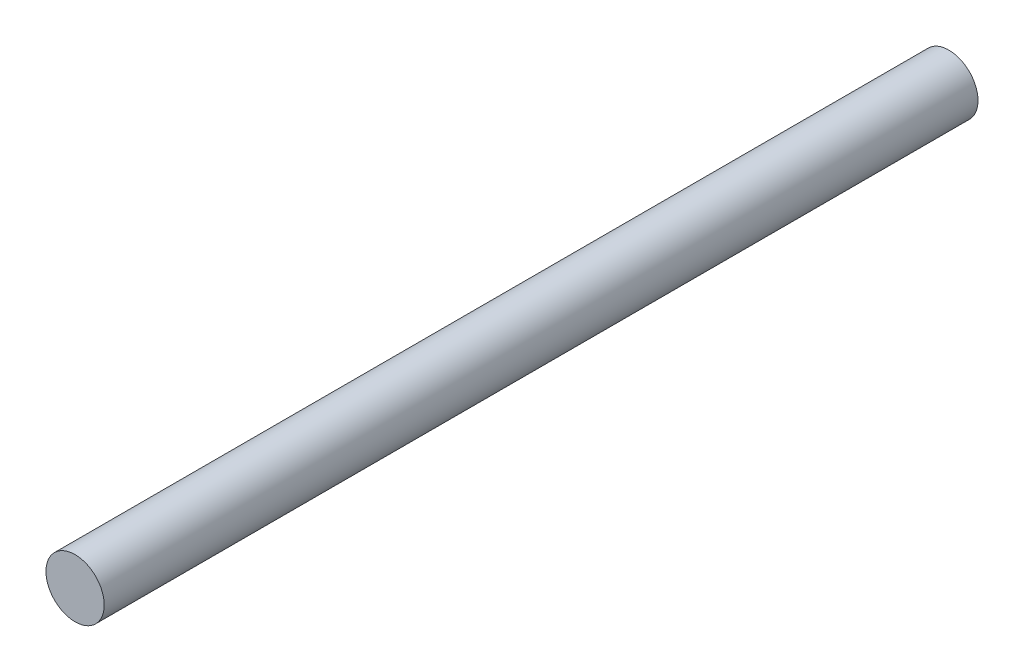
ISO-10303-21;
HEADER;
FILE_DESCRIPTION(('STEP AP214'),'2;1');
FILE_NAME('part.step','',(''),(''),'','','');
FILE_SCHEMA(('AUTOMOTIVE_DESIGN { 1 0 10303 214 1 1 1 1 }'));
ENDSEC;
DATA;
#1=APPLICATION_CONTEXT('core data for automotive mechanical design processes');
#2=APPLICATION_PROTOCOL_DEFINITION('international standard','automotive_design',2000,#1);
#3=PRODUCT_CONTEXT('',#1,'mechanical');
#4=PRODUCT('Part','Part','',(#3));
#5=PRODUCT_RELATED_PRODUCT_CATEGORY('part','',(#4));
#6=PRODUCT_DEFINITION_FORMATION('','',#4);
#7=PRODUCT_DEFINITION_CONTEXT('part definition',#1,'design');
#8=PRODUCT_DEFINITION('design','',#6,#7);
#9=PRODUCT_DEFINITION_SHAPE('','',#8);
#10=(LENGTH_UNIT() NAMED_UNIT(*) SI_UNIT(.MILLI.,.METRE.));
#11=(NAMED_UNIT(*) PLANE_ANGLE_UNIT() SI_UNIT($,.RADIAN.));
#12=(NAMED_UNIT(*) SI_UNIT($,.STERADIAN.) SOLID_ANGLE_UNIT());
#13=UNCERTAINTY_MEASURE_WITH_UNIT(LENGTH_MEASURE(1.E-05),#10,'distance_accuracy_value','');
#14=(GEOMETRIC_REPRESENTATION_CONTEXT(3) GLOBAL_UNCERTAINTY_ASSIGNED_CONTEXT((#13)) GLOBAL_UNIT_ASSIGNED_CONTEXT((#10,
#11,#12)) REPRESENTATION_CONTEXT('',''));
#15=CARTESIAN_POINT('',(0.,0.,0.));
#16=DIRECTION('',(0.,0.,1.));
#17=DIRECTION('',(1.,0.,0.));
#18=AXIS2_PLACEMENT_3D('',#15,#16,#17);
#19=CARTESIAN_POINT('',(0.,0.,60.));
#20=DIRECTION('',(0.,0.,-1.));
#21=DIRECTION('',(-1.,0.,0.));
#22=AXIS2_PLACEMENT_3D('',#19,#20,#21);
#23=CYLINDRICAL_SURFACE('',#22,4.);
#24=CARTESIAN_POINT('',(0.,0.,60.));
#25=DIRECTION('',(0.,0.,1.));
#26=DIRECTION('',(1.,0.,0.));
#27=AXIS2_PLACEMENT_3D('',#24,#25,#26);
#28=CIRCLE('',#27,4.);
#29=CARTESIAN_POINT('',(4.,0.,60.));
#30=VERTEX_POINT('',#29);
#31=EDGE_CURVE('E10',#30,#30,#28,.T.);
#32=ORIENTED_EDGE('',*,*,#31,.F.);
#33=EDGE_LOOP('',(#32));
#34=FACE_BOUND('',#33,.T.);
#35=CARTESIAN_POINT('',(0.,0.,-60.));
#36=DIRECTION('',(0.,0.,1.));
#37=DIRECTION('',(1.,0.,0.));
#38=AXIS2_PLACEMENT_3D('',#35,#36,#37);
#39=CIRCLE('',#38,4.);
#40=CARTESIAN_POINT('',(4.,0.,-60.));
#41=VERTEX_POINT('',#40);
#42=EDGE_CURVE('E41',#41,#41,#39,.T.);
#43=ORIENTED_EDGE('',*,*,#42,.T.);
#44=EDGE_LOOP('',(#43));
#45=FACE_BOUND('',#44,.T.);
#46=ADVANCED_FACE('F38',(#34,#45),#23,.T.);
#47=CARTESIAN_POINT('',(0.,0.,60.));
#48=DIRECTION('',(0.,0.,1.));
#49=DIRECTION('',(1.,0.,0.));
#50=AXIS2_PLACEMENT_3D('',#47,#48,#49);
#51=PLANE('',#50);
#52=ORIENTED_EDGE('',*,*,#31,.T.);
#53=EDGE_LOOP('',(#52));
#54=FACE_BOUND('',#53,.T.);
#55=ADVANCED_FACE('F55',(#54),#51,.T.);
#56=CARTESIAN_POINT('',(0.,0.,-60.));
#57=DIRECTION('',(0.,0.,1.));
#58=DIRECTION('',(1.,0.,0.));
#59=AXIS2_PLACEMENT_3D('',#56,#57,#58);
#60=PLANE('',#59);
#61=ORIENTED_EDGE('',*,*,#42,.F.);
#62=EDGE_LOOP('',(#61));
#63=FACE_BOUND('',#62,.T.);
#64=ADVANCED_FACE('F53',(#63),#60,.F.);
#65=CLOSED_SHELL('',(#46,#55,#64));
#66=MANIFOLD_SOLID_BREP('B2',#65);
#67=ADVANCED_BREP_SHAPE_REPRESENTATION('',(#18,#66),#14);
#68=SHAPE_DEFINITION_REPRESENTATION(#9,#67);
ENDSEC;
END-ISO-10303-21;
